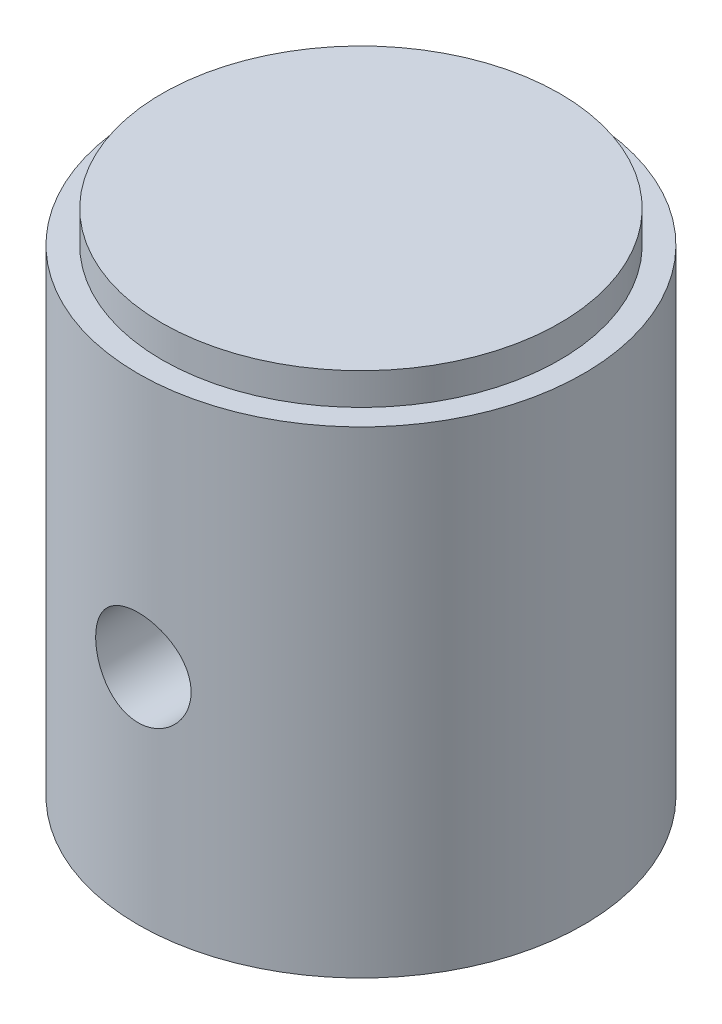
ISO-10303-21;
HEADER;
FILE_DESCRIPTION(('STEP AP214'),'2;1');
FILE_NAME('part.step','',(''),(''),'','','');
FILE_SCHEMA(('AUTOMOTIVE_DESIGN { 1 0 10303 214 1 1 1 1 }'));
ENDSEC;
DATA;
#1=APPLICATION_CONTEXT('core data for automotive mechanical design processes');
#2=APPLICATION_PROTOCOL_DEFINITION('international standard','automotive_design',2000,#1);
#3=PRODUCT_CONTEXT('',#1,'mechanical');
#4=PRODUCT('Part','Part','',(#3));
#5=PRODUCT_RELATED_PRODUCT_CATEGORY('part','',(#4));
#6=PRODUCT_DEFINITION_FORMATION('','',#4);
#7=PRODUCT_DEFINITION_CONTEXT('part definition',#1,'design');
#8=PRODUCT_DEFINITION('design','',#6,#7);
#9=PRODUCT_DEFINITION_SHAPE('','',#8);
#10=(LENGTH_UNIT() NAMED_UNIT(*) SI_UNIT(.MILLI.,.METRE.));
#11=(NAMED_UNIT(*) PLANE_ANGLE_UNIT() SI_UNIT($,.RADIAN.));
#12=(NAMED_UNIT(*) SI_UNIT($,.STERADIAN.) SOLID_ANGLE_UNIT());
#13=UNCERTAINTY_MEASURE_WITH_UNIT(LENGTH_MEASURE(1.E-05),#10,'distance_accuracy_value','');
#14=(GEOMETRIC_REPRESENTATION_CONTEXT(3) GLOBAL_UNCERTAINTY_ASSIGNED_CONTEXT((#13)) GLOBAL_UNIT_ASSIGNED_CONTEXT((#10,
#11,#12)) REPRESENTATION_CONTEXT('',''));
#15=CARTESIAN_POINT('',(0.,0.,0.));
#16=DIRECTION('',(0.,0.,1.));
#17=DIRECTION('',(1.,0.,0.));
#18=AXIS2_PLACEMENT_3D('',#15,#16,#17);
#19=CARTESIAN_POINT('',(0.,16.,0.));
#20=DIRECTION('',(0.,-1.,0.));
#21=DIRECTION('',(0.,0.,-1.));
#22=AXIS2_PLACEMENT_3D('',#19,#20,#21);
#23=CYLINDRICAL_SURFACE('',#22,7.);
#24=CARTESIAN_POINT('',(0.,0.,0.));
#25=DIRECTION('',(0.,1.,0.));
#26=DIRECTION('',(0.,0.,1.));
#27=AXIS2_PLACEMENT_3D('',#24,#25,#26);
#28=CIRCLE('',#27,7.);
#29=CARTESIAN_POINT('',(0.,0.,7.));
#30=VERTEX_POINT('',#29);
#31=EDGE_CURVE('E86',#30,#30,#28,.T.);
#32=ORIENTED_EDGE('',*,*,#31,.T.);
#33=EDGE_LOOP('',(#32));
#34=FACE_BOUND('',#33,.T.);
#35=CARTESIAN_POINT('',(1.5,7.,6.83739716558867));
#36=CARTESIAN_POINT('',(1.49999708238613,6.91678884751805,6.83739884558951));
#37=CARTESIAN_POINT('',(1.49305236244768,6.83354222605788,6.83893272341929));
#38=CARTESIAN_POINT('',(1.46548559252999,6.66941332775799,6.84489178429867));
#39=CARTESIAN_POINT('',(1.44485339653622,6.58853285132379,6.84931911211841));
#40=CARTESIAN_POINT('',(1.39058863684599,6.4315342504258,6.86054115293409));
#41=CARTESIAN_POINT('',(1.35697000991314,6.35541112187853,6.86733332725825));
#42=CARTESIAN_POINT('',(1.27772617673341,6.20988472605539,6.88251670848644));
#43=CARTESIAN_POINT('',(1.23210132048776,6.14048126297092,6.89090786877545));
#44=CARTESIAN_POINT('',(1.12935142570221,6.00923703851788,6.90849578796654));
#45=CARTESIAN_POINT('',(1.07206859483983,5.94752112376004,6.91770249871754));
#46=CARTESIAN_POINT('',(0.947969508129577,5.83449644559421,6.93579691710397));
#47=CARTESIAN_POINT('',(0.881152530217676,5.78318847113993,6.94468460051417));
#48=CARTESIAN_POINT('',(0.739047288464582,5.69194455550857,6.96124769109432));
#49=CARTESIAN_POINT('',(0.663680488229953,5.65212834422938,6.96890998819429));
#50=CARTESIAN_POINT('',(0.507134269342595,5.58577230855371,6.98204671042934));
#51=CARTESIAN_POINT('',(0.425955477380312,5.55923105521372,6.98752137103329));
#52=CARTESIAN_POINT('',(0.261387187671511,5.52057002906866,6.9955956528118));
#53=CARTESIAN_POINT('',(0.178049400596923,5.50823907144757,6.99823733378385));
#54=CARTESIAN_POINT('',(0.0104489453066445,5.49768872268674,7.00049362207002));
#55=CARTESIAN_POINT('',(-0.0738136201647594,5.49946777943924,7.00010856232698));
#56=CARTESIAN_POINT('',(-0.239417029250512,5.51692896466358,6.99638700862558));
#57=CARTESIAN_POINT('',(-0.320783115362113,5.53238350028992,6.99309883152432));
#58=CARTESIAN_POINT('',(-0.479739463978389,5.57639468185186,6.98399541589104));
#59=CARTESIAN_POINT('',(-0.557329560175054,5.60495190429974,6.97818006616518));
#60=CARTESIAN_POINT('',(-0.707167497556553,5.67456145888852,6.96459754646858));
#61=CARTESIAN_POINT('',(-0.779373657015789,5.71570076720435,6.95681685803946));
#62=CARTESIAN_POINT('',(-0.915940926562847,5.8092419681636,6.94015793743865));
#63=CARTESIAN_POINT('',(-0.980301006451529,5.8616453373003,6.93127956144693));
#64=CARTESIAN_POINT('',(-1.10070208800198,5.97746854452786,6.91319326460925));
#65=CARTESIAN_POINT('',(-1.15655117320251,6.04108757935704,6.90398230372853));
#66=CARTESIAN_POINT('',(-1.25682243234728,6.17688328506851,6.88643566831974));
#67=CARTESIAN_POINT('',(-1.30124432118068,6.24906016940525,6.87810001563386));
#68=CARTESIAN_POINT('',(-1.37748077573297,6.40022450106376,6.86324023586723));
#69=CARTESIAN_POINT('',(-1.40926035088923,6.47923012385244,6.85672115127775));
#70=CARTESIAN_POINT('',(-1.45903495159116,6.64163276594644,6.84630340806617));
#71=CARTESIAN_POINT('',(-1.47703206694628,6.72502911744319,6.84240435218483));
#72=CARTESIAN_POINT('',(-1.49843586024652,6.89209575264972,6.83774881255446));
#73=CARTESIAN_POINT('',(-1.5021214192864,6.97572867507731,6.83693227051701));
#74=CARTESIAN_POINT('',(-1.49555139642373,7.1424139931817,6.83837239573994));
#75=CARTESIAN_POINT('',(-1.48529673081635,7.22546642665355,6.84062886101063));
#76=CARTESIAN_POINT('',(-1.45137894635584,7.38767043498076,6.84790415484206));
#77=CARTESIAN_POINT('',(-1.42786830251553,7.46685543259696,6.85289155274364));
#78=CARTESIAN_POINT('',(-1.36827052946749,7.62016233753292,6.86503859869777));
#79=CARTESIAN_POINT('',(-1.33218223662818,7.69428377563419,6.87219844772849));
#80=CARTESIAN_POINT('',(-1.24783504416705,7.83656968475892,6.88801634080345));
#81=CARTESIAN_POINT('',(-1.19940368590792,7.90462958201219,6.89669501746317));
#82=CARTESIAN_POINT('',(-1.09197183833601,8.0317583458738,6.91451775360139));
#83=CARTESIAN_POINT('',(-1.03297009182161,8.09082614144847,6.92366186834461));
#84=CARTESIAN_POINT('',(-0.904812764420815,8.19937030294476,6.94158239990173));
#85=CARTESIAN_POINT('',(-0.835494925828771,8.24865691615701,6.95034935607746));
#86=CARTESIAN_POINT('',(-0.689401481282277,8.33488540935105,6.96635610714901));
#87=CARTESIAN_POINT('',(-0.61262621604374,8.37182785297283,6.97359597176692));
#88=CARTESIAN_POINT('',(-0.45426541898204,8.43205205463848,6.98569278381574));
#89=CARTESIAN_POINT('',(-0.372713193075172,8.45541830374628,6.99056443803698));
#90=CARTESIAN_POINT('',(-0.206725177003289,8.48809170573232,6.9974393930198));
#91=CARTESIAN_POINT('',(-0.122289789973993,8.49740081597391,6.99944309312296));
#92=CARTESIAN_POINT('',(0.0452637170528294,8.50161065241186,7.00034511009057));
#93=CARTESIAN_POINT('',(0.12837450550923,8.49679515860463,6.99930459001667));
#94=CARTESIAN_POINT('',(0.292572938415961,8.47352523648097,6.99436552363383));
#95=CARTESIAN_POINT('',(0.373660616405286,8.45507103442168,6.99046702473686));
#96=CARTESIAN_POINT('',(0.53130194848727,8.40518119375051,6.98025388638537));
#97=CARTESIAN_POINT('',(0.607868365073178,8.37378431061444,6.97394646430493));
#98=CARTESIAN_POINT('',(0.754684956723221,8.29893872883088,6.95959036050661));
#99=CARTESIAN_POINT('',(0.824934544796142,8.25548891169397,6.9515415172034));
#100=CARTESIAN_POINT('',(0.958512306895243,8.15683768125733,6.93439809934493));
#101=CARTESIAN_POINT('',(1.02169036510577,8.10143584167869,6.92528708907874));
#102=CARTESIAN_POINT('',(1.13795001457643,7.98085938974965,6.90713690075836));
#103=CARTESIAN_POINT('',(1.19102918062422,7.9156824366444,6.89809774045682));
#104=CARTESIAN_POINT('',(1.28623261596675,7.77640950681433,6.88098693651916));
#105=CARTESIAN_POINT('',(1.32820897809616,7.70221064171298,6.87292905956533));
#106=CARTESIAN_POINT('',(1.39903004659825,7.54765627907675,6.85886497228049));
#107=CARTESIAN_POINT('',(1.42788606423931,7.46730615474693,6.85285699581573));
#108=CARTESIAN_POINT('',(1.46638607121557,7.32237386881414,6.84470560641996));
#109=CARTESIAN_POINT('',(1.47896752507743,7.25858832429217,6.84198283087953));
#110=CARTESIAN_POINT('',(1.49577544043437,7.12987568842268,6.83832799504406));
#111=CARTESIAN_POINT('',(1.50000227727981,7.06494864849168,6.83739585430069));
#112=CARTESIAN_POINT('',(1.5,7.,6.83739716558867));
#113=B_SPLINE_CURVE_WITH_KNOTS('',3,(#35,#36,#37,#38,#39,#40,#41,#42,#43,#44,#45,#46,#47,#48,
#49,#50,#51,#52,#53,#54,#55,#56,#57,#58,#59,#60,#61,#62,#63,#64,#65,#66,#67,#68,#69,#70,#71,#72,
#73,#74,#75,#76,#77,#78,#79,#80,#81,#82,#83,#84,#85,#86,#87,#88,#89,#90,#91,#92,#93,#94,#95,#96,
#97,#98,#99,#100,#101,#102,#103,#104,#105,#106,#107,#108,#109,#110,#111,#112),.UNSPECIFIED.,.T.,
.F.,(4,2,2,2,2,2,2,2,2,2,2,2,2,2,2,2,2,2,2,2,2,2,2,2,2,2,2,2,2,2,2,2,2,2,2,2,2,2,4),(0.,
0.249395482027528,0.498976038479964,0.74828949115276,0.997595676735284,1.25053229582692,
1.50348808112879,1.75899134820278,2.01446710646268,2.26609508151929,2.51769537777241,
2.76518557667372,3.01268666607584,3.26193888143437,3.51122378872315,3.76548960779295,
4.01976177023092,4.27473287411781,4.52966530953839,4.77960433192523,5.02952692653917,
5.27663180749375,5.5237595556315,5.77455010216318,6.02537049659078,6.2806621468321,
6.53594213875541,6.78961589824375,7.04325433208539,7.29183199644127,7.540405537151,
7.78824009619483,8.03609766151365,8.28848914160965,8.54094115631232,8.79660380167249,
9.05204561611687,9.24671456122272,9.44137476018022),.UNSPECIFIED.);
#114=CARTESIAN_POINT('',(1.5,7.,6.83739716558867));
#115=VERTEX_POINT('',#114);
#116=EDGE_CURVE('E60',#115,#115,#113,.T.);
#117=ORIENTED_EDGE('',*,*,#116,.T.);
#118=EDGE_LOOP('',(#117));
#119=FACE_BOUND('',#118,.T.);
#120=CARTESIAN_POINT('',(0.,8.5,-7.));
#121=CARTESIAN_POINT('',(-0.0832358860906166,8.4999971004257,-6.99999846043226));
#122=CARTESIAN_POINT('',(-0.166507195600275,8.49304839161215,-6.9985002594971));
#123=CARTESIAN_POINT('',(-0.330687344293327,8.46546434314641,-6.99266829827728));
#124=CARTESIAN_POINT('',(-0.41159440357119,8.44481895580507,-6.98833245637099));
#125=CARTESIAN_POINT('',(-0.568649323817737,8.39051563539196,-6.97730831788826));
#126=CARTESIAN_POINT('',(-0.644801963446556,8.35687102061868,-6.97062242967171));
#127=CARTESIAN_POINT('',(-0.790378177960787,8.27756591382874,-6.95562106817971));
#128=CARTESIAN_POINT('',(-0.859801981747369,8.23190583075006,-6.94730565036661));
#129=CARTESIAN_POINT('',(-0.99102479053523,8.12911970032649,-6.92981369246311));
#130=CARTESIAN_POINT('',(-1.05270503419445,8.07184377810147,-6.92062683143259));
#131=CARTESIAN_POINT('',(-1.16566042389435,7.9477736843148,-6.90250069814144));
#132=CARTESIAN_POINT('',(-1.21693467150908,7.88097869174874,-6.8935614473163));
#133=CARTESIAN_POINT('',(-1.30814204379809,7.73889424713956,-6.87684116047225));
#134=CARTESIAN_POINT('',(-1.34794958335009,7.66352248224379,-6.8690733634436));
#135=CARTESIAN_POINT('',(-1.41428823691148,7.50696554623316,-6.85572325558537));
#136=CARTESIAN_POINT('',(-1.44082087001716,7.42578104150743,-6.85014069470711));
#137=CARTESIAN_POINT('',(-1.47946574422454,7.26118891341193,-6.84189808926311));
#138=CARTESIAN_POINT('',(-1.49178779748342,7.17783272433613,-6.83919556896486));
#139=CARTESIAN_POINT('',(-1.50231395206577,7.010195767493,-6.83689139845106));
#140=CARTESIAN_POINT('',(-1.50051971664629,6.92591510982005,-6.83728938291729));
#141=CARTESIAN_POINT('',(-1.48303326340861,6.76037531206621,-6.84110276603832));
#142=CARTESIAN_POINT('',(-1.46758398649408,6.67908911089985,-6.84446541682162));
#143=CARTESIAN_POINT('',(-1.42361054298677,6.52028975971066,-6.85374593375788));
#144=CARTESIAN_POINT('',(-1.39508566936466,6.44277681396768,-6.85966393808402));
#145=CARTESIAN_POINT('',(-1.32554551075991,6.29303712712666,-6.87344080755724));
#146=CARTESIAN_POINT('',(-1.2844361097283,6.22085548728745,-6.88131420983365));
#147=CARTESIAN_POINT('',(-1.19096007283993,6.08432483504204,-6.89810572501288));
#148=CARTESIAN_POINT('',(-1.13859196103562,6.0199768513138,-6.90702397481896));
#149=CARTESIAN_POINT('',(-1.0227954275532,5.8995406443266,-6.92512718393878));
#150=CARTESIAN_POINT('',(-0.959160233964409,5.84365129341526,-6.93431383972178));
#151=CARTESIAN_POINT('',(-0.823317306269096,5.74330626631034,-6.95175017497059));
#152=CARTESIAN_POINT('',(-0.751109428775399,5.69885078139961,-6.95999983875972));
#153=CARTESIAN_POINT('',(-0.599933462049959,5.62258932009307,-6.97465778534003));
#154=CARTESIAN_POINT('',(-0.520952258863482,5.59080858742202,-6.98106238643354));
#155=CARTESIAN_POINT('',(-0.358603146685706,5.54102435167891,-6.99128109245334));
#156=CARTESIAN_POINT('',(-0.275235851133668,5.52301892743668,-6.99509555860384));
#157=CARTESIAN_POINT('',(-0.108187670836629,5.50158378585658,-6.99965306347808));
#158=CARTESIAN_POINT('',(-0.0245431772716145,5.49788228711822,-7.00045336521066));
#159=CARTESIAN_POINT('',(0.142168973650405,5.50442457112516,-6.99905248935969));
#160=CARTESIAN_POINT('',(0.225236668127256,5.51466744796294,-6.99685150675698));
#161=CARTESIAN_POINT('',(0.387542537982806,5.5485822436617,-6.98973143045266));
#162=CARTESIAN_POINT('',(0.466811712908478,5.57211236947253,-6.9848410504546));
#163=CARTESIAN_POINT('',(0.620278450473418,5.63177694299482,-6.9728892442151));
#164=CARTESIAN_POINT('',(0.694475592587741,5.66791243431166,-6.96582763822237));
#165=CARTESIAN_POINT('',(0.836821397964754,5.75233354306033,-6.950175043904));
#166=CARTESIAN_POINT('',(0.904872575111141,5.80077979490973,-6.94156431354275));
#167=CARTESIAN_POINT('',(1.0319769255236,5.90823482488874,-6.92381033034847));
#168=CARTESIAN_POINT('',(1.091028978692,5.96724491588744,-6.91466701142097));
#169=CARTESIAN_POINT('',(1.19952711057989,6.09539737018714,-6.89668172706324));
#170=CARTESIAN_POINT('',(1.24878537255157,6.1647000992221,-6.88784792221285));
#171=CARTESIAN_POINT('',(1.3349641538604,6.31075459647799,-6.87166654559681));
#172=CARTESIAN_POINT('',(1.37188519913706,6.38750604697749,-6.86431891048055));
#173=CARTESIAN_POINT('',(1.43209741248548,6.5458722989946,-6.8520100980739));
#174=CARTESIAN_POINT('',(1.45546398641275,6.62745735643067,-6.84703574582967));
#175=CARTESIAN_POINT('',(1.48812696085335,6.79351558383364,-6.84001186708418));
#176=CARTESIAN_POINT('',(1.49742550780258,6.87798831120132,-6.83796189439706));
#177=CARTESIAN_POINT('',(1.5015999992604,7.04553234317524,-6.83704618848155));
#178=CARTESIAN_POINT('',(1.49677347258311,7.12859601498058,-6.83811476518543));
#179=CARTESIAN_POINT('',(1.47349789406331,7.29269724213259,-6.8431676318483));
#180=CARTESIAN_POINT('',(1.45504898957979,7.37373481938658,-6.84715189026714));
#181=CARTESIAN_POINT('',(1.40519345940434,7.53125865786917,-6.85755581104157));
#182=CARTESIAN_POINT('',(1.37382847170887,7.60775864866429,-6.86396764224703));
#183=CARTESIAN_POINT('',(1.29906751595601,7.75445537250685,-6.87850764590649));
#184=CARTESIAN_POINT('',(1.255670353015,7.82465147861504,-6.88663598880363));
#185=CARTESIAN_POINT('',(1.15708290349304,7.95821819372537,-6.90389055593232));
#186=CARTESIAN_POINT('',(1.10167987421237,8.02142969594698,-6.91303309938926));
#187=CARTESIAN_POINT('',(0.981086554619621,8.13775626252046,-6.93117449799694));
#188=CARTESIAN_POINT('',(0.915894009385597,8.1908689943122,-6.94017331951296));
#189=CARTESIAN_POINT('',(0.776603147268716,8.28611595950556,-6.95714491048987));
#190=CARTESIAN_POINT('',(0.70240484600964,8.32810660623098,-6.96510364570626));
#191=CARTESIAN_POINT('',(0.547850160940597,8.39895452890618,-6.97895826104019));
#192=CARTESIAN_POINT('',(0.467499105863879,8.42782302258504,-6.98485590212343));
#193=CARTESIAN_POINT('',(0.322535217553204,8.46635218513115,-6.99284848461772));
#194=CARTESIAN_POINT('',(0.25871720554598,8.47894643398003,-6.99551391888263));
#195=CARTESIAN_POINT('',(0.129939960853847,8.49577130171167,-6.99909024154719));
#196=CARTESIAN_POINT('',(0.0649807750887453,8.50000226364606,-7.00000120191314));
#197=CARTESIAN_POINT('',(0.,8.5,-7.));
#198=B_SPLINE_CURVE_WITH_KNOTS('',3,(#120,#121,#122,#123,#124,#125,#126,#127,#128,#129,#130,
#131,#132,#133,#134,#135,#136,#137,#138,#139,#140,#141,#142,#143,#144,#145,#146,#147,#148,#149,
#150,#151,#152,#153,#154,#155,#156,#157,#158,#159,#160,#161,#162,#163,#164,#165,#166,#167,#168,
#169,#170,#171,#172,#173,#174,#175,#176,#177,#178,#179,#180,#181,#182,#183,#184,#185,#186,#187,
#188,#189,#190,#191,#192,#193,#194,#195,#196,#197),.UNSPECIFIED.,.T.,.F.,(4,2,2,2,2,2,2,2,2,2,2,
2,2,2,2,2,2,2,2,2,2,2,2,2,2,2,2,2,2,2,2,2,2,2,2,2,2,2,4),(0.,0.249469836512082,
0.499122883219936,0.748520824425602,0.997910278645886,1.25074961881732,1.50361077918507,
1.7591442921451,2.0146485567749,2.26633008124666,2.51798195169165,2.76524475452928,
3.01252092904568,3.26169356165968,3.51089887920889,3.76527011050291,4.0196455970235,
4.27452521139806,4.52936927256343,4.77934665704185,5.02930780231429,5.27665060589267,
5.52401389198434,5.77478733867803,6.02559197304485,6.28082063283534,6.53603841075806,
6.78982240408475,7.04356767229185,7.29200680540294,7.5404432510827,7.78808499706785,
8.03575134451623,8.28822950154114,8.54076590397115,8.79641910357222,9.05185334010271,
9.24661799132294,9.44137465337336),.UNSPECIFIED.);
#199=CARTESIAN_POINT('',(0.,8.5,-7.));
#200=VERTEX_POINT('',#199);
#201=EDGE_CURVE('E11',#200,#200,#198,.T.);
#202=ORIENTED_EDGE('',*,*,#201,.T.);
#203=EDGE_LOOP('',(#202));
#204=FACE_BOUND('',#203,.T.);
#205=CARTESIAN_POINT('',(0.,15.,0.));
#206=DIRECTION('',(0.,1.,0.));
#207=DIRECTION('',(0.,0.,1.));
#208=AXIS2_PLACEMENT_3D('',#205,#206,#207);
#209=CIRCLE('',#208,7.);
#210=CARTESIAN_POINT('',(0.,15.,7.));
#211=VERTEX_POINT('',#210);
#212=EDGE_CURVE('E136',#211,#211,#209,.T.);
#213=ORIENTED_EDGE('',*,*,#212,.F.);
#214=EDGE_LOOP('',(#213));
#215=FACE_BOUND('',#214,.T.);
#216=ADVANCED_FACE('F46',(#34,#119,#204,#215),#23,.T.);
#217=CARTESIAN_POINT('',(0.,7.,-7.));
#218=DIRECTION('',(0.,0.,1.));
#219=DIRECTION('',(1.,0.,0.));
#220=AXIS2_PLACEMENT_3D('',#217,#218,#219);
#221=CYLINDRICAL_SURFACE('',#220,1.5);
#222=CARTESIAN_POINT('',(1.5,7.,-4.50693909432999));
#223=CARTESIAN_POINT('',(1.49999958004515,7.08196828267614,-4.50693949515469));
#224=CARTESIAN_POINT('',(1.49325840231682,7.16394098372474,-4.50919970874085));
#225=CARTESIAN_POINT('',(1.46655104887094,7.32547500949945,-4.5179553253781));
#226=CARTESIAN_POINT('',(1.44658152131253,7.40503571772268,-4.52445180182028));
#227=CARTESIAN_POINT('',(1.39417508352591,7.55938220284953,-4.54087234787262));
#228=CARTESIAN_POINT('',(1.36176059537411,7.63417628681151,-4.55079024986066));
#229=CARTESIAN_POINT('',(1.28545946652237,7.77728605600465,-4.57292751994247));
#230=CARTESIAN_POINT('',(1.24157071835092,7.84560054798797,-4.58514731070763));
#231=CARTESIAN_POINT('',(1.14191784971278,7.97620867145206,-4.6109923380212));
#232=CARTESIAN_POINT('',(1.08582030493755,8.03824156373591,-4.62464992232587));
#233=CARTESIAN_POINT('',(0.964055421977067,8.15219435282351,-4.65155671093151));
#234=CARTESIAN_POINT('',(0.898386720233771,8.20411280620364,-4.66480585671778));
#235=CARTESIAN_POINT('',(0.757464836701735,8.29751850612538,-4.68977365915903));
#236=CARTESIAN_POINT('',(0.682025001056138,8.33873651170335,-4.70144979545653));
#237=CARTESIAN_POINT('',(0.524852067423557,8.40779725722458,-4.72157773016225));
#238=CARTESIAN_POINT('',(0.443120487221092,8.43564321130615,-4.73003030329318));
#239=CARTESIAN_POINT('',(0.278414775826808,8.47629673110112,-4.74252974850081));
#240=CARTESIAN_POINT('',(0.195560751143444,8.48955010145606,-4.74670693307633));
#241=CARTESIAN_POINT('',(0.0287067286102965,8.50205550409757,-4.75064554540298));
#242=CARTESIAN_POINT('',(-0.0552929988694207,8.50131078451008,-4.75040799755164));
#243=CARTESIAN_POINT('',(-0.218913619351864,8.48613280044412,-4.74563427350171));
#244=CARTESIAN_POINT('',(-0.298584494979865,8.47218295028315,-4.74124990899214));
#245=CARTESIAN_POINT('',(-0.454390311754809,8.43178484234958,-4.72886249486103));
#246=CARTESIAN_POINT('',(-0.530525020335841,8.40533576380501,-4.72085920760149));
#247=CARTESIAN_POINT('',(-0.678203652675078,8.34038381811517,-4.7019310355991));
#248=CARTESIAN_POINT('',(-0.749679013295809,8.30173567232402,-4.69097118266663));
#249=CARTESIAN_POINT('',(-0.885279102378908,8.21359968541286,-4.66728249867119));
#250=CARTESIAN_POINT('',(-0.949401935733848,8.16410905917775,-4.65455321340063));
#251=CARTESIAN_POINT('',(-1.07135837440922,8.05321803376508,-4.62803989727125));
#252=CARTESIAN_POINT('',(-1.12880871974839,7.99140076594742,-4.61423403233704));
#253=CARTESIAN_POINT('',(-1.23264301054731,7.85888184102085,-4.58758892442481));
#254=CARTESIAN_POINT('',(-1.2790255944206,7.7881790924274,-4.57474980051078));
#255=CARTESIAN_POINT('',(-1.35986638692084,7.63879322816875,-4.55138024059369));
#256=CARTESIAN_POINT('',(-1.39417963639867,7.5600268613839,-4.54087839223385));
#257=CARTESIAN_POINT('',(-1.44893342452635,7.39742189828439,-4.5237069894911));
#258=CARTESIAN_POINT('',(-1.46937907304313,7.31358518268336,-4.5170360236621));
#259=CARTESIAN_POINT('',(-1.49507161979024,7.14689763967609,-4.5085959379324));
#260=CARTESIAN_POINT('',(-1.50090655288536,7.06414699632123,-4.50663729609299));
#261=CARTESIAN_POINT('',(-1.49886513965521,6.89884228403352,-4.50731687465408));
#262=CARTESIAN_POINT('',(-1.49099096720734,6.81628818601273,-4.50995436623754));
#263=CARTESIAN_POINT('',(-1.46228084598242,6.65627331210253,-4.51934163323602));
#264=CARTESIAN_POINT('',(-1.4418371919129,6.57873407933305,-4.5259668251803));
#265=CARTESIAN_POINT('',(-1.38903056686353,6.42819606752119,-4.54245022183902));
#266=CARTESIAN_POINT('',(-1.35666562487664,6.35519804163378,-4.55230896114271));
#267=CARTESIAN_POINT('',(-1.2798587413425,6.21345829627849,-4.57450539166734));
#268=CARTESIAN_POINT('',(-1.2350921421442,6.14490277172614,-4.58690698850857));
#269=CARTESIAN_POINT('',(-1.13512998682984,6.01606295424143,-4.61266077618539));
#270=CARTESIAN_POINT('',(-1.07993166463933,5.9557808624266,-4.62601321856053));
#271=CARTESIAN_POINT('',(-0.957886037531119,5.84255822339201,-4.65285013455169));
#272=CARTESIAN_POINT('',(-0.890643665109767,5.79003801711159,-4.66631614662306));
#273=CARTESIAN_POINT('',(-0.747973360630616,5.69700869180867,-4.6912975579683));
#274=CARTESIAN_POINT('',(-0.672545793179843,5.65649903807951,-4.70281304406929));
#275=CARTESIAN_POINT('',(-0.516099288450847,5.58902763746837,-4.72253168708172));
#276=CARTESIAN_POINT('',(-0.435125281433142,5.56196896821548,-4.73075845435933));
#277=CARTESIAN_POINT('',(-0.269469399491868,5.521946955657,-4.7430763734001));
#278=CARTESIAN_POINT('',(-0.184788721002361,5.50897909853475,-4.74716884950256));
#279=CARTESIAN_POINT('',(-0.0179886485878241,5.49787969673414,-4.7506674317259));
#280=CARTESIAN_POINT('',(0.0640868361538648,5.49914159728498,-4.75026513795577));
#281=CARTESIAN_POINT('',(0.226803220963033,5.51499454533605,-4.74528029002946));
#282=CARTESIAN_POINT('',(0.307444217580877,5.52958469227172,-4.74069801830655));
#283=CARTESIAN_POINT('',(0.463969836764499,5.57129105994288,-4.72793024704182));
#284=CARTESIAN_POINT('',(0.539902672774311,5.5982419327476,-4.71979237633648));
#285=CARTESIAN_POINT('',(0.686204345183072,5.66375485659461,-4.70075227796057));
#286=CARTESIAN_POINT('',(0.756572215112847,5.70231891893586,-4.68984957149724));
#287=CARTESIAN_POINT('',(0.892382156713932,5.79149731947347,-4.66594837362514));
#288=CARTESIAN_POINT('',(0.957571386267191,5.84248067140566,-4.65289067194133));
#289=CARTESIAN_POINT('',(1.07867009763973,5.95440321249846,-4.62631837968684));
#290=CARTESIAN_POINT('',(1.13457676425287,6.0153454108894,-4.61280365200012));
#291=CARTESIAN_POINT('',(1.23744612372159,6.14794144277214,-4.58630016066439));
#292=CARTESIAN_POINT('',(1.28403955823579,6.21988929825807,-4.5733449634976));
#293=CARTESIAN_POINT('',(1.36442560849337,6.37098605672067,-4.55001145096037));
#294=CARTESIAN_POINT('',(1.39822313048984,6.45013218524502,-4.53963214845841));
#295=CARTESIAN_POINT('',(1.44974900503547,6.60694645257124,-4.52342799882926));
#296=CARTESIAN_POINT('',(1.46853682069789,6.6842364458579,-4.51730787458817));
#297=CARTESIAN_POINT('',(1.4936609032698,6.84101662585257,-4.50906374742014));
#298=CARTESIAN_POINT('',(1.50000040727695,6.92050623511172,-4.50693870560567));
#299=CARTESIAN_POINT('',(1.5,7.,-4.50693909432999));
#300=B_SPLINE_CURVE_WITH_KNOTS('',3,(#222,#223,#224,#225,#226,#227,#228,#229,#230,#231,#232,
#233,#234,#235,#236,#237,#238,#239,#240,#241,#242,#243,#244,#245,#246,#247,#248,#249,#250,#251,
#252,#253,#254,#255,#256,#257,#258,#259,#260,#261,#262,#263,#264,#265,#266,#267,#268,#269,#270,
#271,#272,#273,#274,#275,#276,#277,#278,#279,#280,#281,#282,#283,#284,#285,#286,#287,#288,#289,
#290,#291,#292,#293,#294,#295,#296,#297,#298,#299),.UNSPECIFIED.,.T.,.F.,(4,2,2,2,2,2,2,2,2,2,2,
2,2,2,2,2,2,2,2,2,2,2,2,2,2,2,2,2,2,2,2,2,2,2,2,2,2,2,4),(0.,0.245611090579273,
0.491284438685785,0.736517218845767,0.981795072467574,1.23487733964253,1.48799569757339,
1.74697244897189,2.00588692090239,2.25665093580603,2.50735676398231,2.74922580012767,
2.99111072100683,3.2359924360223,3.48093712787276,3.7362950135404,3.99168429786021,
4.25004385973256,4.50830817072249,4.75599786818586,5.00364829262799,5.24393641423545,
5.48426428174336,5.73160040316639,5.97900220045884,6.23690747266809,6.49480126127746,
6.75080881416402,7.0067343340116,7.25179355317672,7.49683621537552,7.73869250201122,
7.98059070007259,8.23081327027949,8.48111158966216,8.739930558781,8.99865018989115,
9.23690856092584,9.47510496630383),.UNSPECIFIED.);
#301=CARTESIAN_POINT('',(1.5,7.,-4.50693909432999));
#302=VERTEX_POINT('',#301);
#303=EDGE_CURVE('E50',#302,#302,#300,.T.);
#304=ORIENTED_EDGE('',*,*,#303,.T.);
#305=EDGE_LOOP('',(#304));
#306=FACE_BOUND('',#305,.T.);
#307=ORIENTED_EDGE('',*,*,#201,.F.);
#308=EDGE_LOOP('',(#307));
#309=FACE_BOUND('',#308,.T.);
#310=ADVANCED_FACE('F104',(#306,#309),#221,.F.);
#311=CARTESIAN_POINT('',(0.,0.,0.));
#312=DIRECTION('',(0.,1.,0.));
#313=DIRECTION('',(0.,0.,1.));
#314=AXIS2_PLACEMENT_3D('',#311,#312,#313);
#315=PLANE('',#314);
#316=CARTESIAN_POINT('',(0.,0.,0.));
#317=DIRECTION('',(0.,-1.,0.));
#318=DIRECTION('',(0.,0.,-1.));
#319=AXIS2_PLACEMENT_3D('',#316,#317,#318);
#320=CIRCLE('',#319,6.2);
#321=CARTESIAN_POINT('',(0.,0.,-6.2));
#322=VERTEX_POINT('',#321);
#323=EDGE_CURVE('E82',#322,#322,#320,.T.);
#324=ORIENTED_EDGE('',*,*,#323,.F.);
#325=EDGE_LOOP('',(#324));
#326=FACE_BOUND('',#325,.T.);
#327=ORIENTED_EDGE('',*,*,#31,.F.);
#328=EDGE_LOOP('',(#327));
#329=FACE_BOUND('',#328,.T.);
#330=ADVANCED_FACE('F102',(#326,#329),#315,.F.);
#331=CARTESIAN_POINT('',(1.5,7.,4.50693909432999));
#332=CARTESIAN_POINT('',(1.49999958004515,6.91803171732386,4.50693949515469));
#333=CARTESIAN_POINT('',(1.49325840231682,6.83605901627526,4.50919970874085));
#334=CARTESIAN_POINT('',(1.46655104887094,6.67452499050055,4.5179553253781));
#335=CARTESIAN_POINT('',(1.44658152131253,6.59496428227732,4.52445180182028));
#336=CARTESIAN_POINT('',(1.39417508352591,6.44061779715047,4.54087234787262));
#337=CARTESIAN_POINT('',(1.36176059537411,6.36582371318849,4.55079024986066));
#338=CARTESIAN_POINT('',(1.28545946652237,6.22271394399535,4.57292751994247));
#339=CARTESIAN_POINT('',(1.24157071835092,6.15439945201203,4.58514731070763));
#340=CARTESIAN_POINT('',(1.14191784971278,6.02379132854794,4.6109923380212));
#341=CARTESIAN_POINT('',(1.08582030493755,5.96175843626409,4.62464992232587));
#342=CARTESIAN_POINT('',(0.964055421977067,5.84780564717649,4.65155671093151));
#343=CARTESIAN_POINT('',(0.89838672023377,5.79588719379636,4.66480585671778));
#344=CARTESIAN_POINT('',(0.757464836701734,5.70248149387462,4.68977365915903));
#345=CARTESIAN_POINT('',(0.682025001056138,5.66126348829665,4.70144979545653));
#346=CARTESIAN_POINT('',(0.524852067423557,5.59220274277542,4.72157773016225));
#347=CARTESIAN_POINT('',(0.443120487221091,5.56435678869385,4.73003030329318));
#348=CARTESIAN_POINT('',(0.278414775826807,5.52370326889888,4.74252974850081));
#349=CARTESIAN_POINT('',(0.195560751143444,5.51044989854395,4.74670693307633));
#350=CARTESIAN_POINT('',(0.0287067286102967,5.49794449590243,4.75064554540298));
#351=CARTESIAN_POINT('',(-0.0552929988694204,5.49868921548992,4.75040799755164));
#352=CARTESIAN_POINT('',(-0.218913619351864,5.51386719955588,4.74563427350171));
#353=CARTESIAN_POINT('',(-0.298584494979865,5.52781704971685,4.74124990899214));
#354=CARTESIAN_POINT('',(-0.454390311754809,5.56821515765042,4.72886249486103));
#355=CARTESIAN_POINT('',(-0.530525020335841,5.59466423619499,4.72085920760149));
#356=CARTESIAN_POINT('',(-0.678203652675078,5.65961618188483,4.7019310355991));
#357=CARTESIAN_POINT('',(-0.74967901329581,5.69826432767598,4.69097118266663));
#358=CARTESIAN_POINT('',(-0.885279102378908,5.78640031458714,4.66728249867119));
#359=CARTESIAN_POINT('',(-0.949401935733847,5.83589094082225,4.65455321340063));
#360=CARTESIAN_POINT('',(-1.07135837440922,5.94678196623492,4.62803989727125));
#361=CARTESIAN_POINT('',(-1.12880871974839,6.00859923405259,4.61423403233704));
#362=CARTESIAN_POINT('',(-1.23264301054731,6.14111815897915,4.58758892442481));
#363=CARTESIAN_POINT('',(-1.2790255944206,6.2118209075726,4.57474980051078));
#364=CARTESIAN_POINT('',(-1.35986638692084,6.36120677183125,4.55138024059369));
#365=CARTESIAN_POINT('',(-1.39417963639867,6.4399731386161,4.54087839223385));
#366=CARTESIAN_POINT('',(-1.44893342452635,6.60257810171561,4.5237069894911));
#367=CARTESIAN_POINT('',(-1.46937907304313,6.68641481731664,4.5170360236621));
#368=CARTESIAN_POINT('',(-1.49507161979024,6.85310236032391,4.5085959379324));
#369=CARTESIAN_POINT('',(-1.50090655288536,6.93585300367877,4.50663729609299));
#370=CARTESIAN_POINT('',(-1.49886513965521,7.10115771596648,4.50731687465408));
#371=CARTESIAN_POINT('',(-1.49099096720734,7.18371181398727,4.50995436623754));
#372=CARTESIAN_POINT('',(-1.46228084598242,7.34372668789747,4.51934163323602));
#373=CARTESIAN_POINT('',(-1.4418371919129,7.42126592066695,4.5259668251803));
#374=CARTESIAN_POINT('',(-1.38903056686353,7.57180393247881,4.54245022183902));
#375=CARTESIAN_POINT('',(-1.35666562487664,7.64480195836622,4.55230896114271));
#376=CARTESIAN_POINT('',(-1.2798587413425,7.78654170372151,4.57450539166734));
#377=CARTESIAN_POINT('',(-1.2350921421442,7.85509722827386,4.58690698850857));
#378=CARTESIAN_POINT('',(-1.13512998682984,7.98393704575857,4.61266077618539));
#379=CARTESIAN_POINT('',(-1.07993166463934,8.0442191375734,4.62601321856053));
#380=CARTESIAN_POINT('',(-0.95788603753112,8.15744177660799,4.65285013455169));
#381=CARTESIAN_POINT('',(-0.890643665109768,8.20996198288841,4.66631614662306));
#382=CARTESIAN_POINT('',(-0.747973360630617,8.30299130819133,4.6912975579683));
#383=CARTESIAN_POINT('',(-0.672545793179843,8.34350096192049,4.70281304406929));
#384=CARTESIAN_POINT('',(-0.516099288450846,8.41097236253163,4.72253168708172));
#385=CARTESIAN_POINT('',(-0.435125281433141,8.43803103178452,4.73075845435933));
#386=CARTESIAN_POINT('',(-0.269469399491867,8.478053044343,4.7430763734001));
#387=CARTESIAN_POINT('',(-0.184788721002362,8.49102090146525,4.74716884950256));
#388=CARTESIAN_POINT('',(-0.0179886485878248,8.50212030326586,4.7506674317259));
#389=CARTESIAN_POINT('',(0.064086836153864,8.50085840271502,4.75026513795577));
#390=CARTESIAN_POINT('',(0.226803220963032,8.48500545466395,4.74528029002946));
#391=CARTESIAN_POINT('',(0.307444217580876,8.47041530772828,4.74069801830655));
#392=CARTESIAN_POINT('',(0.463969836764499,8.42870894005712,4.72793024704182));
#393=CARTESIAN_POINT('',(0.539902672774311,8.4017580672524,4.71979237633648));
#394=CARTESIAN_POINT('',(0.686204345183071,8.33624514340539,4.70075227796057));
#395=CARTESIAN_POINT('',(0.756572215112847,8.29768108106414,4.68984957149724));
#396=CARTESIAN_POINT('',(0.892382156713933,8.20850268052653,4.66594837362514));
#397=CARTESIAN_POINT('',(0.957571386267192,8.15751932859434,4.65289067194133));
#398=CARTESIAN_POINT('',(1.07867009763973,8.04559678750154,4.62631837968684));
#399=CARTESIAN_POINT('',(1.13457676425287,7.98465458911059,4.61280365200012));
#400=CARTESIAN_POINT('',(1.23744612372159,7.85205855722786,4.58630016066439));
#401=CARTESIAN_POINT('',(1.28403955823579,7.78011070174193,4.5733449634976));
#402=CARTESIAN_POINT('',(1.36442560849337,7.62901394327933,4.55001145096037));
#403=CARTESIAN_POINT('',(1.39822313048984,7.54986781475498,4.53963214845841));
#404=CARTESIAN_POINT('',(1.44974900503547,7.39305354742876,4.52342799882926));
#405=CARTESIAN_POINT('',(1.46853682069789,7.3157635541421,4.51730787458817));
#406=CARTESIAN_POINT('',(1.4936609032698,7.15898337414743,4.50906374742014));
#407=CARTESIAN_POINT('',(1.50000040727695,7.07949376488828,4.50693870560567));
#408=CARTESIAN_POINT('',(1.5,7.,4.50693909432999));
#409=B_SPLINE_CURVE_WITH_KNOTS('',3,(#331,#332,#333,#334,#335,#336,#337,#338,#339,#340,#341,
#342,#343,#344,#345,#346,#347,#348,#349,#350,#351,#352,#353,#354,#355,#356,#357,#358,#359,#360,
#361,#362,#363,#364,#365,#366,#367,#368,#369,#370,#371,#372,#373,#374,#375,#376,#377,#378,#379,
#380,#381,#382,#383,#384,#385,#386,#387,#388,#389,#390,#391,#392,#393,#394,#395,#396,#397,#398,
#399,#400,#401,#402,#403,#404,#405,#406,#407,#408),.UNSPECIFIED.,.T.,.F.,(4,2,2,2,2,2,2,2,2,2,2,
2,2,2,2,2,2,2,2,2,2,2,2,2,2,2,2,2,2,2,2,2,2,2,2,2,2,2,4),(0.,0.245611090579273,
0.491284438685785,0.736517218845768,0.981795072467575,1.23487733964253,1.48799569757339,
1.74697244897189,2.00588692090239,2.25665093580603,2.50735676398231,2.74922580012767,
2.99111072100683,3.2359924360223,3.48093712787276,3.7362950135404,3.99168429786021,
4.25004385973256,4.50830817072249,4.75599786818586,5.00364829262799,5.24393641423545,
5.48426428174336,5.7316004031664,5.97900220045884,6.23690747266809,6.49480126127746,
6.75080881416402,7.0067343340116,7.25179355317672,7.49683621537552,7.73869250201122,
7.98059070007259,8.2308132702795,8.48111158966217,8.739930558781,8.99865018989115,
9.23690856092584,9.47510496630383),.UNSPECIFIED.);
#410=CARTESIAN_POINT('',(1.5,7.,4.50693909432999));
#411=VERTEX_POINT('',#410);
#412=EDGE_CURVE('E75',#411,#411,#409,.T.);
#413=ORIENTED_EDGE('',*,*,#412,.T.);
#414=EDGE_LOOP('',(#413));
#415=FACE_BOUND('',#414,.T.);
#416=ORIENTED_EDGE('',*,*,#116,.F.);
#417=EDGE_LOOP('',(#416));
#418=FACE_BOUND('',#417,.T.);
#419=ADVANCED_FACE('F98',(#415,#418),#221,.F.);
#420=CARTESIAN_POINT('',(0.,11.,0.));
#421=DIRECTION('',(0.,-1.,0.));
#422=DIRECTION('',(0.,0.,-1.));
#423=AXIS2_PLACEMENT_3D('',#420,#421,#422);
#424=CYLINDRICAL_SURFACE('',#423,4.75);
#425=CARTESIAN_POINT('',(0.,3.98384225820928,0.));
#426=DIRECTION('',(0.,-1.,0.));
#427=DIRECTION('',(0.,0.,-1.));
#428=AXIS2_PLACEMENT_3D('',#425,#426,#427);
#429=CIRCLE('',#428,4.75);
#430=CARTESIAN_POINT('',(0.,3.98384225820928,-4.75));
#431=VERTEX_POINT('',#430);
#432=EDGE_CURVE('E76',#431,#431,#429,.T.);
#433=ORIENTED_EDGE('',*,*,#432,.T.);
#434=EDGE_LOOP('',(#433));
#435=FACE_BOUND('',#434,.T.);
#436=ORIENTED_EDGE('',*,*,#412,.F.);
#437=EDGE_LOOP('',(#436));
#438=FACE_BOUND('',#437,.T.);
#439=CARTESIAN_POINT('',(0.,11.,0.));
#440=DIRECTION('',(0.,-1.,0.));
#441=DIRECTION('',(1.,0.,0.));
#442=AXIS2_PLACEMENT_3D('',#439,#440,#441);
#443=CIRCLE('',#442,4.75);
#444=CARTESIAN_POINT('',(4.75,11.,0.));
#445=VERTEX_POINT('',#444);
#446=EDGE_CURVE('E72',#445,#445,#443,.T.);
#447=ORIENTED_EDGE('',*,*,#446,.F.);
#448=EDGE_LOOP('',(#447));
#449=FACE_BOUND('',#448,.T.);
#450=ORIENTED_EDGE('',*,*,#303,.F.);
#451=EDGE_LOOP('',(#450));
#452=FACE_BOUND('',#451,.T.);
#453=ADVANCED_FACE('F68',(#435,#438,#449,#452),#424,.F.);
#454=CARTESIAN_POINT('',(0.,11.,0.));
#455=DIRECTION('',(0.,-1.,0.));
#456=DIRECTION('',(1.,0.,0.));
#457=AXIS2_PLACEMENT_3D('',#454,#455,#456);
#458=CONICAL_SURFACE('',#457,4.75,1.02974425867665);
#459=CARTESIAN_POINT('',(0.,13.8540879403809,0.));
#460=VERTEX_POINT('',#459);
#461=VERTEX_LOOP('',#460);
#462=FACE_BOUND('',#461,.T.);
#463=ORIENTED_EDGE('',*,*,#446,.T.);
#464=EDGE_LOOP('',(#463));
#465=FACE_BOUND('',#464,.T.);
#466=ADVANCED_FACE('F64',(#462,#465),#458,.F.);
#467=CARTESIAN_POINT('',(0.,0.,0.));
#468=DIRECTION('',(0.,-1.,0.));
#469=DIRECTION('',(0.,0.,-1.));
#470=AXIS2_PLACEMENT_3D('',#467,#468,#469);
#471=CONICAL_SURFACE('',#470,6.2,0.34906585039886);
#472=ORIENTED_EDGE('',*,*,#432,.F.);
#473=EDGE_LOOP('',(#472));
#474=FACE_BOUND('',#473,.T.);
#475=ORIENTED_EDGE('',*,*,#323,.T.);
#476=EDGE_LOOP('',(#475));
#477=FACE_BOUND('',#476,.T.);
#478=ADVANCED_FACE('F67',(#474,#477),#471,.F.);
#479=CARTESIAN_POINT('',(0.,15.,0.));
#480=DIRECTION('',(0.,1.,0.));
#481=DIRECTION('',(0.,0.,1.));
#482=AXIS2_PLACEMENT_3D('',#479,#480,#481);
#483=PLANE('',#482);
#484=CARTESIAN_POINT('',(0.,15.,0.));
#485=DIRECTION('',(0.,1.,0.));
#486=DIRECTION('',(0.,0.,1.));
#487=AXIS2_PLACEMENT_3D('',#484,#485,#486);
#488=CIRCLE('',#487,6.25);
#489=CARTESIAN_POINT('',(0.,15.,6.25));
#490=VERTEX_POINT('',#489);
#491=EDGE_CURVE('E139',#490,#490,#488,.T.);
#492=ORIENTED_EDGE('',*,*,#491,.F.);
#493=EDGE_LOOP('',(#492));
#494=FACE_BOUND('',#493,.T.);
#495=ORIENTED_EDGE('',*,*,#212,.T.);
#496=EDGE_LOOP('',(#495));
#497=FACE_BOUND('',#496,.T.);
#498=ADVANCED_FACE('F153',(#494,#497),#483,.T.);
#499=CARTESIAN_POINT('',(0.,15.,0.));
#500=DIRECTION('',(0.,1.,0.));
#501=DIRECTION('',(0.,0.,1.));
#502=AXIS2_PLACEMENT_3D('',#499,#500,#501);
#503=CYLINDRICAL_SURFACE('',#502,6.25);
#504=ORIENTED_EDGE('',*,*,#491,.T.);
#505=EDGE_LOOP('',(#504));
#506=FACE_BOUND('',#505,.T.);
#507=CARTESIAN_POINT('',(0.,16.,0.));
#508=DIRECTION('',(0.,1.,0.));
#509=DIRECTION('',(0.,0.,1.));
#510=AXIS2_PLACEMENT_3D('',#507,#508,#509);
#511=CIRCLE('',#510,6.25);
#512=CARTESIAN_POINT('',(0.,16.,6.25));
#513=VERTEX_POINT('',#512);
#514=EDGE_CURVE('E145',#513,#513,#511,.T.);
#515=ORIENTED_EDGE('',*,*,#514,.F.);
#516=EDGE_LOOP('',(#515));
#517=FACE_BOUND('',#516,.T.);
#518=ADVANCED_FACE('F114',(#506,#517),#503,.T.);
#519=CARTESIAN_POINT('',(0.,16.,0.));
#520=DIRECTION('',(0.,1.,0.));
#521=DIRECTION('',(0.,0.,1.));
#522=AXIS2_PLACEMENT_3D('',#519,#520,#521);
#523=PLANE('',#522);
#524=ORIENTED_EDGE('',*,*,#514,.T.);
#525=EDGE_LOOP('',(#524));
#526=FACE_BOUND('',#525,.T.);
#527=ADVANCED_FACE('F106',(#526),#523,.T.);
#528=CLOSED_SHELL('',(#216,#310,#330,#419,#453,#466,#478,#498,#518,#527));
#529=MANIFOLD_SOLID_BREP('B2',#528);
#530=ADVANCED_BREP_SHAPE_REPRESENTATION('',(#18,#529),#14);
#531=SHAPE_DEFINITION_REPRESENTATION(#9,#530);
ENDSEC;
END-ISO-10303-21;
